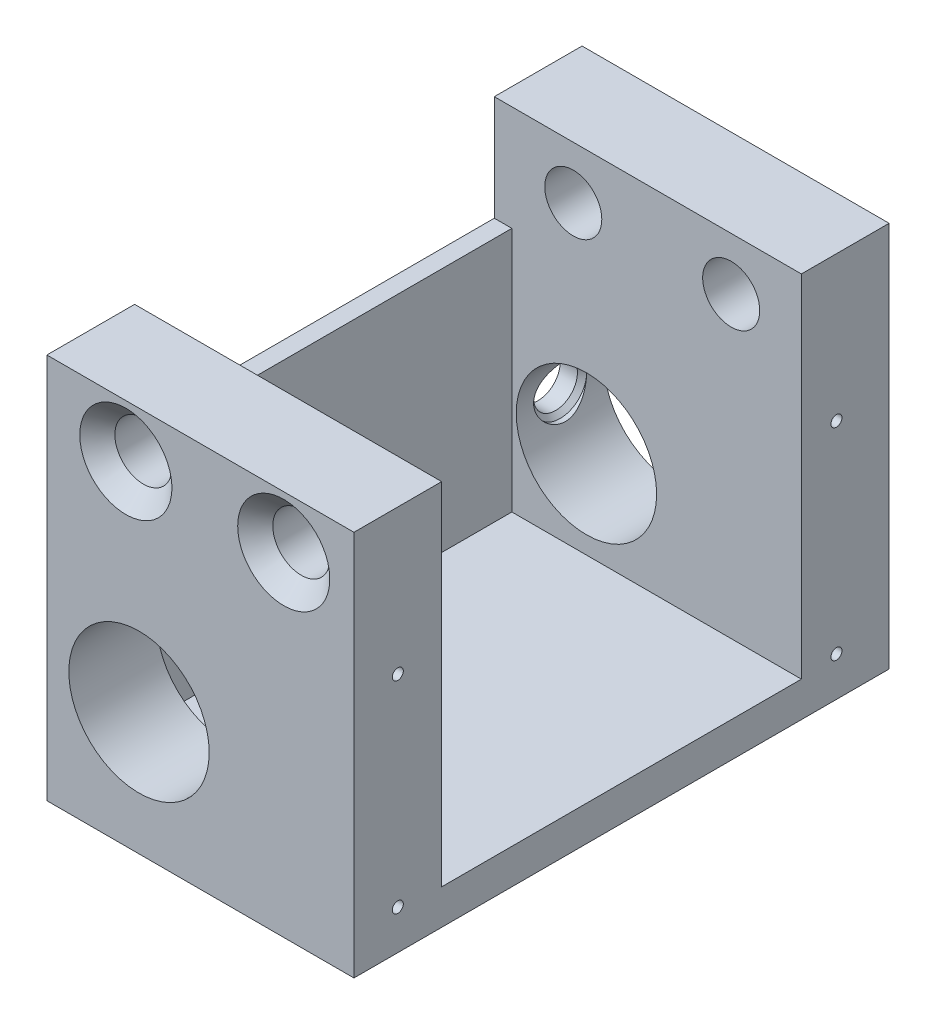
ISO-10303-21;
HEADER;
FILE_DESCRIPTION(('STEP AP214'),'2;1');
FILE_NAME('part.step','',(''),(''),'','','');
FILE_SCHEMA(('AUTOMOTIVE_DESIGN { 1 0 10303 214 1 1 1 1 }'));
ENDSEC;
DATA;
#1=APPLICATION_CONTEXT('core data for automotive mechanical design processes');
#2=APPLICATION_PROTOCOL_DEFINITION('international standard','automotive_design',2000,#1);
#3=PRODUCT_CONTEXT('',#1,'mechanical');
#4=PRODUCT('Part','Part','',(#3));
#5=PRODUCT_RELATED_PRODUCT_CATEGORY('part','',(#4));
#6=PRODUCT_DEFINITION_FORMATION('','',#4);
#7=PRODUCT_DEFINITION_CONTEXT('part definition',#1,'design');
#8=PRODUCT_DEFINITION('design','',#6,#7);
#9=PRODUCT_DEFINITION_SHAPE('','',#8);
#10=(LENGTH_UNIT() NAMED_UNIT(*) SI_UNIT(.MILLI.,.METRE.));
#11=(NAMED_UNIT(*) PLANE_ANGLE_UNIT() SI_UNIT($,.RADIAN.));
#12=(NAMED_UNIT(*) SI_UNIT($,.STERADIAN.) SOLID_ANGLE_UNIT());
#13=UNCERTAINTY_MEASURE_WITH_UNIT(LENGTH_MEASURE(1.E-05),#10,'distance_accuracy_value','');
#14=(GEOMETRIC_REPRESENTATION_CONTEXT(3) GLOBAL_UNCERTAINTY_ASSIGNED_CONTEXT((#13)) GLOBAL_UNIT_ASSIGNED_CONTEXT((#10,
#11,#12)) REPRESENTATION_CONTEXT('',''));
#15=CARTESIAN_POINT('',(0.,0.,0.));
#16=DIRECTION('',(0.,0.,1.));
#17=DIRECTION('',(1.,0.,0.));
#18=AXIS2_PLACEMENT_3D('',#15,#16,#17);
#19=CARTESIAN_POINT('',(0.,0.,30.5));
#20=DIRECTION('',(1.,0.,0.));
#21=DIRECTION('',(0.,0.,-1.));
#22=AXIS2_PLACEMENT_3D('',#19,#20,#21);
#23=PLANE('',#22);
#24=DIRECTION('',(0.,0.,-1.));
#25=VECTOR('',#24,1.);
#26=CARTESIAN_POINT('',(0.,32.,30.5));
#27=LINE('',#26,#25);
#28=CARTESIAN_POINT('',(0.,32.,20.5));
#29=VERTEX_POINT('',#28);
#30=CARTESIAN_POINT('',(0.,32.,-20.5));
#31=VERTEX_POINT('',#30);
#32=EDGE_CURVE('E204',#29,#31,#27,.T.);
#33=ORIENTED_EDGE('',*,*,#32,.T.);
#34=DIRECTION('',(0.,1.,0.));
#35=VECTOR('',#34,1.);
#36=CARTESIAN_POINT('',(0.,0.,-20.5));
#37=LINE('',#36,#35);
#38=CARTESIAN_POINT('',(0.,44.,-20.5));
#39=VERTEX_POINT('',#38);
#40=EDGE_CURVE('E207',#31,#39,#37,.T.);
#41=ORIENTED_EDGE('',*,*,#40,.T.);
#42=DIRECTION('',(0.,0.,-1.));
#43=VECTOR('',#42,1.);
#44=CARTESIAN_POINT('',(0.,44.,30.5));
#45=LINE('',#44,#43);
#46=CARTESIAN_POINT('',(0.,44.,-30.5));
#47=VERTEX_POINT('',#46);
#48=EDGE_CURVE('E94',#39,#47,#45,.T.);
#49=ORIENTED_EDGE('',*,*,#48,.T.);
#50=DIRECTION('',(0.,-1.,0.));
#51=VECTOR('',#50,1.);
#52=CARTESIAN_POINT('',(0.,0.,-30.5));
#53=LINE('',#52,#51);
#54=CARTESIAN_POINT('',(0.,0.,-30.5));
#55=VERTEX_POINT('',#54);
#56=EDGE_CURVE('E228',#47,#55,#53,.T.);
#57=ORIENTED_EDGE('',*,*,#56,.T.);
#58=DIRECTION('',(0.,0.,-1.));
#59=VECTOR('',#58,1.);
#60=CARTESIAN_POINT('',(0.,0.,30.5));
#61=LINE('',#60,#59);
#62=CARTESIAN_POINT('',(0.,0.,30.5));
#63=VERTEX_POINT('',#62);
#64=EDGE_CURVE('E167',#63,#55,#61,.T.);
#65=ORIENTED_EDGE('',*,*,#64,.F.);
#66=DIRECTION('',(0.,-1.,0.));
#67=VECTOR('',#66,1.);
#68=CARTESIAN_POINT('',(0.,0.,30.5));
#69=LINE('',#68,#67);
#70=CARTESIAN_POINT('',(0.,44.,30.5));
#71=VERTEX_POINT('',#70);
#72=EDGE_CURVE('E235',#71,#63,#69,.T.);
#73=ORIENTED_EDGE('',*,*,#72,.F.);
#74=CARTESIAN_POINT('',(0.,44.,20.5));
#75=VERTEX_POINT('',#74);
#76=EDGE_CURVE('E249',#71,#75,#45,.T.);
#77=ORIENTED_EDGE('',*,*,#76,.T.);
#78=DIRECTION('',(0.,-1.,0.));
#79=VECTOR('',#78,1.);
#80=CARTESIAN_POINT('',(0.,0.,20.5));
#81=LINE('',#80,#79);
#82=EDGE_CURVE('E200',#75,#29,#81,.T.);
#83=ORIENTED_EDGE('',*,*,#82,.T.);
#84=EDGE_LOOP('',(#33,#41,#49,#57,#65,#73,#77,#83));
#85=FACE_BOUND('',#84,.T.);
#86=CARTESIAN_POINT('',(0.,14.,-25.5));
#87=DIRECTION('',(-1.,0.,0.));
#88=DIRECTION('',(0.,0.,1.));
#89=AXIS2_PLACEMENT_3D('',#86,#87,#88);
#90=CIRCLE('',#89,2.49999999999999);
#91=CARTESIAN_POINT('',(0.,14.,-23.));
#92=VERTEX_POINT('',#91);
#93=EDGE_CURVE('E164',#92,#92,#90,.T.);
#94=ORIENTED_EDGE('',*,*,#93,.F.);
#95=EDGE_LOOP('',(#94));
#96=FACE_BOUND('',#95,.T.);
#97=ADVANCED_FACE('F45',(#85,#96),#23,.F.);
#98=CARTESIAN_POINT('',(2.,4.,20.5));
#99=DIRECTION('',(0.,0.,1.));
#100=DIRECTION('',(1.,0.,0.));
#101=AXIS2_PLACEMENT_3D('',#98,#99,#100);
#102=PLANE('',#101);
#103=CARTESIAN_POINT('',(10.5,14.,20.5));
#104=DIRECTION('',(0.,0.,1.));
#105=DIRECTION('',(1.,0.,0.));
#106=AXIS2_PLACEMENT_3D('',#103,#104,#105);
#107=CIRCLE('',#106,8.);
#108=CARTESIAN_POINT('',(18.5,14.,20.5));
#109=VERTEX_POINT('',#108);
#110=EDGE_CURVE('E175',#109,#109,#107,.T.);
#111=ORIENTED_EDGE('',*,*,#110,.T.);
#112=EDGE_LOOP('',(#111));
#113=FACE_BOUND('',#112,.T.);
#114=DIRECTION('',(0.,-1.,0.));
#115=VECTOR('',#114,1.);
#116=CARTESIAN_POINT('',(35.,4.,20.5));
#117=LINE('',#116,#115);
#118=CARTESIAN_POINT('',(35.,44.,20.5));
#119=VERTEX_POINT('',#118);
#120=CARTESIAN_POINT('',(35.,4.,20.5));
#121=VERTEX_POINT('',#120);
#122=EDGE_CURVE('E221',#119,#121,#117,.T.);
#123=ORIENTED_EDGE('',*,*,#122,.T.);
#124=DIRECTION('',(1.,0.,0.));
#125=VECTOR('',#124,1.);
#126=CARTESIAN_POINT('',(2.,4.,20.5));
#127=LINE('',#126,#125);
#128=CARTESIAN_POINT('',(2.,4.,20.5));
#129=VERTEX_POINT('',#128);
#130=EDGE_CURVE('E229',#129,#121,#127,.T.);
#131=ORIENTED_EDGE('',*,*,#130,.F.);
#132=DIRECTION('',(0.,-1.,0.));
#133=VECTOR('',#132,1.);
#134=CARTESIAN_POINT('',(2.,4.,20.5));
#135=LINE('',#134,#133);
#136=CARTESIAN_POINT('',(2.,32.,20.5));
#137=VERTEX_POINT('',#136);
#138=EDGE_CURVE('E213',#137,#129,#135,.T.);
#139=ORIENTED_EDGE('',*,*,#138,.F.);
#140=DIRECTION('',(1.,0.,0.));
#141=VECTOR('',#140,1.);
#142=CARTESIAN_POINT('',(-31.,32.,20.5));
#143=LINE('',#142,#141);
#144=EDGE_CURVE('E197',#29,#137,#143,.T.);
#145=ORIENTED_EDGE('',*,*,#144,.F.);
#146=ORIENTED_EDGE('',*,*,#82,.F.);
#147=DIRECTION('',(1.,0.,0.));
#148=VECTOR('',#147,1.);
#149=CARTESIAN_POINT('',(2.,44.,20.5));
#150=LINE('',#149,#148);
#151=EDGE_CURVE('E231',#75,#119,#150,.T.);
#152=ORIENTED_EDGE('',*,*,#151,.T.);
#153=EDGE_LOOP('',(#123,#131,#139,#145,#146,#152));
#154=FACE_BOUND('',#153,.T.);
#155=CARTESIAN_POINT('',(27.,38.,20.5));
#156=DIRECTION('',(0.,0.,-1.));
#157=DIRECTION('',(-1.,0.,0.));
#158=AXIS2_PLACEMENT_3D('',#155,#156,#157);
#159=CIRCLE('',#158,3.25);
#160=CARTESIAN_POINT('',(23.75,38.,20.5));
#161=VERTEX_POINT('',#160);
#162=EDGE_CURVE('E459',#161,#161,#159,.T.);
#163=ORIENTED_EDGE('',*,*,#162,.F.);
#164=EDGE_LOOP('',(#163));
#165=FACE_BOUND('',#164,.T.);
#166=CARTESIAN_POINT('',(9.,38.,20.5));
#167=DIRECTION('',(0.,0.,-1.));
#168=DIRECTION('',(-1.,0.,0.));
#169=AXIS2_PLACEMENT_3D('',#166,#167,#168);
#170=CIRCLE('',#169,3.25);
#171=CARTESIAN_POINT('',(5.75,38.,20.5));
#172=VERTEX_POINT('',#171);
#173=EDGE_CURVE('E450',#172,#172,#170,.T.);
#174=ORIENTED_EDGE('',*,*,#173,.F.);
#175=EDGE_LOOP('',(#174));
#176=FACE_BOUND('',#175,.T.);
#177=ADVANCED_FACE('F277',(#113,#154,#165,#176),#102,.F.);
#178=CARTESIAN_POINT('',(2.,4.,-20.5));
#179=DIRECTION('',(0.,0.,-1.));
#180=DIRECTION('',(-1.,0.,0.));
#181=AXIS2_PLACEMENT_3D('',#178,#179,#180);
#182=PLANE('',#181);
#183=CARTESIAN_POINT('',(27.,38.,-20.5));
#184=DIRECTION('',(0.,0.,1.));
#185=DIRECTION('',(1.,0.,0.));
#186=AXIS2_PLACEMENT_3D('',#183,#184,#185);
#187=CIRCLE('',#186,3.25);
#188=CARTESIAN_POINT('',(30.25,38.,-20.5));
#189=VERTEX_POINT('',#188);
#190=EDGE_CURVE('E332',#189,#189,#187,.T.);
#191=ORIENTED_EDGE('',*,*,#190,.F.);
#192=EDGE_LOOP('',(#191));
#193=FACE_BOUND('',#192,.T.);
#194=CARTESIAN_POINT('',(10.5,14.,-20.5));
#195=DIRECTION('',(0.,0.,-1.));
#196=DIRECTION('',(-1.,0.,0.));
#197=AXIS2_PLACEMENT_3D('',#194,#195,#196);
#198=CIRCLE('',#197,8.);
#199=CARTESIAN_POINT('',(2.5,14.,-20.5));
#200=VERTEX_POINT('',#199);
#201=EDGE_CURVE('E177',#200,#200,#198,.T.);
#202=ORIENTED_EDGE('',*,*,#201,.T.);
#203=EDGE_LOOP('',(#202));
#204=FACE_BOUND('',#203,.T.);
#205=DIRECTION('',(0.,1.,0.));
#206=VECTOR('',#205,1.);
#207=CARTESIAN_POINT('',(35.,4.,-20.5));
#208=LINE('',#207,#206);
#209=CARTESIAN_POINT('',(35.,4.,-20.5));
#210=VERTEX_POINT('',#209);
#211=CARTESIAN_POINT('',(35.,44.,-20.5));
#212=VERTEX_POINT('',#211);
#213=EDGE_CURVE('E209',#210,#212,#208,.T.);
#214=ORIENTED_EDGE('',*,*,#213,.T.);
#215=DIRECTION('',(1.,0.,0.));
#216=VECTOR('',#215,1.);
#217=CARTESIAN_POINT('',(2.,44.,-20.5));
#218=LINE('',#217,#216);
#219=EDGE_CURVE('E219',#39,#212,#218,.T.);
#220=ORIENTED_EDGE('',*,*,#219,.F.);
#221=ORIENTED_EDGE('',*,*,#40,.F.);
#222=DIRECTION('',(1.,0.,0.));
#223=VECTOR('',#222,1.);
#224=CARTESIAN_POINT('',(-31.,32.,-20.5));
#225=LINE('',#224,#223);
#226=CARTESIAN_POINT('',(2.,32.,-20.5));
#227=VERTEX_POINT('',#226);
#228=EDGE_CURVE('E198',#31,#227,#225,.T.);
#229=ORIENTED_EDGE('',*,*,#228,.T.);
#230=DIRECTION('',(0.,1.,0.));
#231=VECTOR('',#230,1.);
#232=CARTESIAN_POINT('',(2.,4.,-20.5));
#233=LINE('',#232,#231);
#234=CARTESIAN_POINT('',(2.,4.,-20.5));
#235=VERTEX_POINT('',#234);
#236=EDGE_CURVE('E210',#235,#227,#233,.T.);
#237=ORIENTED_EDGE('',*,*,#236,.F.);
#238=DIRECTION('',(1.,0.,0.));
#239=VECTOR('',#238,1.);
#240=CARTESIAN_POINT('',(2.,4.,-20.5));
#241=LINE('',#240,#239);
#242=EDGE_CURVE('E226',#235,#210,#241,.T.);
#243=ORIENTED_EDGE('',*,*,#242,.T.);
#244=EDGE_LOOP('',(#214,#220,#221,#229,#237,#243));
#245=FACE_BOUND('',#244,.T.);
#246=CARTESIAN_POINT('',(9.,38.,-20.5));
#247=DIRECTION('',(0.,0.,1.));
#248=DIRECTION('',(1.,0.,0.));
#249=AXIS2_PLACEMENT_3D('',#246,#247,#248);
#250=CIRCLE('',#249,3.25);
#251=CARTESIAN_POINT('',(12.25,38.,-20.5));
#252=VERTEX_POINT('',#251);
#253=EDGE_CURVE('E468',#252,#252,#250,.T.);
#254=ORIENTED_EDGE('',*,*,#253,.F.);
#255=EDGE_LOOP('',(#254));
#256=FACE_BOUND('',#255,.T.);
#257=ADVANCED_FACE('F286',(#193,#204,#245,#256),#182,.F.);
#258=CARTESIAN_POINT('',(0.,44.,30.5));
#259=DIRECTION('',(0.,-1.,0.));
#260=DIRECTION('',(0.,0.,-1.));
#261=AXIS2_PLACEMENT_3D('',#258,#259,#260);
#262=PLANE('',#261);
#263=ORIENTED_EDGE('',*,*,#48,.F.);
#264=ORIENTED_EDGE('',*,*,#219,.T.);
#265=DIRECTION('',(0.,0.,-1.));
#266=VECTOR('',#265,1.);
#267=CARTESIAN_POINT('',(35.,44.,30.5));
#268=LINE('',#267,#266);
#269=CARTESIAN_POINT('',(35.,44.,-30.5));
#270=VERTEX_POINT('',#269);
#271=EDGE_CURVE('E251',#212,#270,#268,.T.);
#272=ORIENTED_EDGE('',*,*,#271,.T.);
#273=DIRECTION('',(-1.,0.,0.));
#274=VECTOR('',#273,1.);
#275=CARTESIAN_POINT('',(0.,44.,-30.5));
#276=LINE('',#275,#274);
#277=EDGE_CURVE('E237',#270,#47,#276,.T.);
#278=ORIENTED_EDGE('',*,*,#277,.T.);
#279=EDGE_LOOP('',(#263,#264,#272,#278));
#280=FACE_BOUND('',#279,.T.);
#281=ADVANCED_FACE('F257',(#280),#262,.F.);
#282=CARTESIAN_POINT('',(0.,0.,30.5));
#283=DIRECTION('',(0.,1.,0.));
#284=DIRECTION('',(0.,0.,1.));
#285=AXIS2_PLACEMENT_3D('',#282,#283,#284);
#286=PLANE('',#285);
#287=DIRECTION('',(1.,0.,0.));
#288=VECTOR('',#287,1.);
#289=CARTESIAN_POINT('',(0.,0.,-30.5));
#290=LINE('',#289,#288);
#291=CARTESIAN_POINT('',(35.,0.,-30.5));
#292=VERTEX_POINT('',#291);
#293=EDGE_CURVE('E243',#55,#292,#290,.T.);
#294=ORIENTED_EDGE('',*,*,#293,.T.);
#295=DIRECTION('',(0.,0.,-1.));
#296=VECTOR('',#295,1.);
#297=CARTESIAN_POINT('',(35.,0.,30.5));
#298=LINE('',#297,#296);
#299=CARTESIAN_POINT('',(35.,0.,30.5));
#300=VERTEX_POINT('',#299);
#301=EDGE_CURVE('E168',#300,#292,#298,.T.);
#302=ORIENTED_EDGE('',*,*,#301,.F.);
#303=DIRECTION('',(1.,0.,0.));
#304=VECTOR('',#303,1.);
#305=CARTESIAN_POINT('',(0.,0.,30.5));
#306=LINE('',#305,#304);
#307=EDGE_CURVE('E102',#63,#300,#306,.T.);
#308=ORIENTED_EDGE('',*,*,#307,.F.);
#309=ORIENTED_EDGE('',*,*,#64,.T.);
#310=EDGE_LOOP('',(#294,#302,#308,#309));
#311=FACE_BOUND('',#310,.T.);
#312=ADVANCED_FACE('F270',(#311),#286,.F.);
#313=CARTESIAN_POINT('',(35.,0.,30.5));
#314=DIRECTION('',(-1.,0.,0.));
#315=DIRECTION('',(0.,0.,1.));
#316=AXIS2_PLACEMENT_3D('',#313,#314,#315);
#317=PLANE('',#316);
#318=CARTESIAN_POINT('',(35.,4.49999999999999,25.5));
#319=DIRECTION('',(1.,0.,0.));
#320=DIRECTION('',(0.,0.,-1.));
#321=AXIS2_PLACEMENT_3D('',#318,#319,#320);
#322=CIRCLE('',#321,0.62499999999999);
#323=CARTESIAN_POINT('',(35.,4.49999999999999,24.875));
#324=VERTEX_POINT('',#323);
#325=EDGE_CURVE('E421',#324,#324,#322,.T.);
#326=ORIENTED_EDGE('',*,*,#325,.F.);
#327=EDGE_LOOP('',(#326));
#328=FACE_BOUND('',#327,.T.);
#329=CARTESIAN_POINT('',(35.,27.5,-24.5));
#330=DIRECTION('',(1.,0.,0.));
#331=DIRECTION('',(0.,0.,-1.));
#332=AXIS2_PLACEMENT_3D('',#329,#330,#331);
#333=CIRCLE('',#332,0.62499999999999);
#334=CARTESIAN_POINT('',(35.,27.5,-25.125));
#335=VERTEX_POINT('',#334);
#336=EDGE_CURVE('E429',#335,#335,#333,.T.);
#337=ORIENTED_EDGE('',*,*,#336,.F.);
#338=EDGE_LOOP('',(#337));
#339=FACE_BOUND('',#338,.T.);
#340=CARTESIAN_POINT('',(35.,4.5,-24.5));
#341=DIRECTION('',(1.,0.,0.));
#342=DIRECTION('',(0.,0.,-1.));
#343=AXIS2_PLACEMENT_3D('',#340,#341,#342);
#344=CIRCLE('',#343,0.62499999999999);
#345=CARTESIAN_POINT('',(35.,4.5,-25.125));
#346=VERTEX_POINT('',#345);
#347=EDGE_CURVE('E435',#346,#346,#344,.T.);
#348=ORIENTED_EDGE('',*,*,#347,.F.);
#349=EDGE_LOOP('',(#348));
#350=FACE_BOUND('',#349,.T.);
#351=CARTESIAN_POINT('',(35.,27.5,25.5));
#352=DIRECTION('',(1.,0.,0.));
#353=DIRECTION('',(0.,0.,-1.));
#354=AXIS2_PLACEMENT_3D('',#351,#352,#353);
#355=CIRCLE('',#354,0.62499999999999);
#356=CARTESIAN_POINT('',(35.,27.5,24.875));
#357=VERTEX_POINT('',#356);
#358=EDGE_CURVE('E441',#357,#357,#355,.T.);
#359=ORIENTED_EDGE('',*,*,#358,.F.);
#360=EDGE_LOOP('',(#359));
#361=FACE_BOUND('',#360,.T.);
#362=ORIENTED_EDGE('',*,*,#271,.F.);
#363=ORIENTED_EDGE('',*,*,#213,.F.);
#364=DIRECTION('',(0.,0.,-1.));
#365=VECTOR('',#364,1.);
#366=CARTESIAN_POINT('',(35.,4.,20.5));
#367=LINE('',#366,#365);
#368=EDGE_CURVE('E214',#121,#210,#367,.T.);
#369=ORIENTED_EDGE('',*,*,#368,.F.);
#370=ORIENTED_EDGE('',*,*,#122,.F.);
#371=CARTESIAN_POINT('',(35.,44.,30.5));
#372=VERTEX_POINT('',#371);
#373=EDGE_CURVE('E172',#372,#119,#268,.T.);
#374=ORIENTED_EDGE('',*,*,#373,.F.);
#375=DIRECTION('',(0.,1.,0.));
#376=VECTOR('',#375,1.);
#377=CARTESIAN_POINT('',(35.,0.,30.5));
#378=LINE('',#377,#376);
#379=EDGE_CURVE('E239',#300,#372,#378,.T.);
#380=ORIENTED_EDGE('',*,*,#379,.F.);
#381=ORIENTED_EDGE('',*,*,#301,.T.);
#382=DIRECTION('',(0.,1.,0.));
#383=VECTOR('',#382,1.);
#384=CARTESIAN_POINT('',(35.,0.,-30.5));
#385=LINE('',#384,#383);
#386=EDGE_CURVE('E245',#292,#270,#385,.T.);
#387=ORIENTED_EDGE('',*,*,#386,.T.);
#388=EDGE_LOOP('',(#362,#363,#369,#370,#374,#380,#381,#387));
#389=FACE_BOUND('',#388,.T.);
#390=ADVANCED_FACE('F263',(#328,#339,#350,#361,#389),#317,.F.);
#391=ORIENTED_EDGE('',*,*,#151,.F.);
#392=ORIENTED_EDGE('',*,*,#76,.F.);
#393=DIRECTION('',(-1.,0.,0.));
#394=VECTOR('',#393,1.);
#395=CARTESIAN_POINT('',(0.,44.,30.5));
#396=LINE('',#395,#394);
#397=EDGE_CURVE('E72',#372,#71,#396,.T.);
#398=ORIENTED_EDGE('',*,*,#397,.F.);
#399=ORIENTED_EDGE('',*,*,#373,.T.);
#400=EDGE_LOOP('',(#391,#392,#398,#399));
#401=FACE_BOUND('',#400,.T.);
#402=ADVANCED_FACE('F273',(#401),#262,.F.);
#403=CARTESIAN_POINT('',(0.,0.,30.5));
#404=DIRECTION('',(0.,0.,-1.));
#405=DIRECTION('',(-1.,0.,0.));
#406=AXIS2_PLACEMENT_3D('',#403,#404,#405);
#407=PLANE('',#406);
#408=CARTESIAN_POINT('',(9.,38.,30.5));
#409=DIRECTION('',(0.,0.,-1.));
#410=DIRECTION('',(-1.,0.,0.));
#411=AXIS2_PLACEMENT_3D('',#408,#409,#410);
#412=CIRCLE('',#411,5.25);
#413=CARTESIAN_POINT('',(3.75,38.,30.5));
#414=VERTEX_POINT('',#413);
#415=EDGE_CURVE('E447',#414,#414,#412,.T.);
#416=ORIENTED_EDGE('',*,*,#415,.T.);
#417=EDGE_LOOP('',(#416));
#418=FACE_BOUND('',#417,.T.);
#419=CARTESIAN_POINT('',(27.,38.,30.5));
#420=DIRECTION('',(0.,0.,-1.));
#421=DIRECTION('',(-1.,0.,0.));
#422=AXIS2_PLACEMENT_3D('',#419,#420,#421);
#423=CIRCLE('',#422,5.25);
#424=CARTESIAN_POINT('',(21.75,38.,30.5));
#425=VERTEX_POINT('',#424);
#426=EDGE_CURVE('E456',#425,#425,#423,.T.);
#427=ORIENTED_EDGE('',*,*,#426,.T.);
#428=EDGE_LOOP('',(#427));
#429=FACE_BOUND('',#428,.T.);
#430=CARTESIAN_POINT('',(10.5,14.,30.5));
#431=DIRECTION('',(0.,0.,1.));
#432=DIRECTION('',(1.,0.,0.));
#433=AXIS2_PLACEMENT_3D('',#430,#431,#432);
#434=CIRCLE('',#433,8.);
#435=CARTESIAN_POINT('',(18.5,14.,30.5));
#436=VERTEX_POINT('',#435);
#437=EDGE_CURVE('E185',#436,#436,#434,.T.);
#438=ORIENTED_EDGE('',*,*,#437,.F.);
#439=EDGE_LOOP('',(#438));
#440=FACE_BOUND('',#439,.T.);
#441=ORIENTED_EDGE('',*,*,#72,.T.);
#442=ORIENTED_EDGE('',*,*,#307,.T.);
#443=ORIENTED_EDGE('',*,*,#379,.T.);
#444=ORIENTED_EDGE('',*,*,#397,.T.);
#445=EDGE_LOOP('',(#441,#442,#443,#444));
#446=FACE_BOUND('',#445,.T.);
#447=ADVANCED_FACE('F269',(#418,#429,#440,#446),#407,.F.);
#448=CARTESIAN_POINT('',(0.,0.,-30.5));
#449=DIRECTION('',(0.,0.,-1.));
#450=DIRECTION('',(-1.,0.,0.));
#451=AXIS2_PLACEMENT_3D('',#448,#449,#450);
#452=PLANE('',#451);
#453=CARTESIAN_POINT('',(9.,38.,-30.5));
#454=DIRECTION('',(0.,0.,1.));
#455=DIRECTION('',(1.,0.,0.));
#456=AXIS2_PLACEMENT_3D('',#453,#454,#455);
#457=CIRCLE('',#456,5.25);
#458=CARTESIAN_POINT('',(14.25,38.,-30.5));
#459=VERTEX_POINT('',#458);
#460=EDGE_CURVE('E465',#459,#459,#457,.T.);
#461=ORIENTED_EDGE('',*,*,#460,.T.);
#462=EDGE_LOOP('',(#461));
#463=FACE_BOUND('',#462,.T.);
#464=CARTESIAN_POINT('',(27.,38.,-30.5));
#465=DIRECTION('',(0.,0.,1.));
#466=DIRECTION('',(1.,0.,0.));
#467=AXIS2_PLACEMENT_3D('',#464,#465,#466);
#468=CIRCLE('',#467,5.25);
#469=CARTESIAN_POINT('',(32.25,38.,-30.5));
#470=VERTEX_POINT('',#469);
#471=EDGE_CURVE('E474',#470,#470,#468,.T.);
#472=ORIENTED_EDGE('',*,*,#471,.T.);
#473=EDGE_LOOP('',(#472));
#474=FACE_BOUND('',#473,.T.);
#475=CARTESIAN_POINT('',(10.5,14.,-30.5));
#476=DIRECTION('',(0.,0.,1.));
#477=DIRECTION('',(1.,0.,0.));
#478=AXIS2_PLACEMENT_3D('',#475,#476,#477);
#479=CIRCLE('',#478,8.);
#480=CARTESIAN_POINT('',(18.5,14.,-30.5));
#481=VERTEX_POINT('',#480);
#482=EDGE_CURVE('E178',#481,#481,#479,.T.);
#483=ORIENTED_EDGE('',*,*,#482,.T.);
#484=EDGE_LOOP('',(#483));
#485=FACE_BOUND('',#484,.T.);
#486=ORIENTED_EDGE('',*,*,#56,.F.);
#487=ORIENTED_EDGE('',*,*,#277,.F.);
#488=ORIENTED_EDGE('',*,*,#386,.F.);
#489=ORIENTED_EDGE('',*,*,#293,.F.);
#490=EDGE_LOOP('',(#486,#487,#488,#489));
#491=FACE_BOUND('',#490,.T.);
#492=ADVANCED_FACE('F266',(#463,#474,#485,#491),#452,.T.);
#493=CARTESIAN_POINT('',(2.,4.,20.5));
#494=DIRECTION('',(0.,-1.,0.));
#495=DIRECTION('',(0.,0.,-1.));
#496=AXIS2_PLACEMENT_3D('',#493,#494,#495);
#497=PLANE('',#496);
#498=ORIENTED_EDGE('',*,*,#368,.T.);
#499=ORIENTED_EDGE('',*,*,#242,.F.);
#500=DIRECTION('',(0.,0.,-1.));
#501=VECTOR('',#500,1.);
#502=CARTESIAN_POINT('',(2.,4.,20.5));
#503=LINE('',#502,#501);
#504=EDGE_CURVE('E216',#129,#235,#503,.T.);
#505=ORIENTED_EDGE('',*,*,#504,.F.);
#506=ORIENTED_EDGE('',*,*,#130,.T.);
#507=EDGE_LOOP('',(#498,#499,#505,#506));
#508=FACE_BOUND('',#507,.T.);
#509=ADVANCED_FACE('F289',(#508),#497,.F.);
#510=CARTESIAN_POINT('',(2.,0.,0.));
#511=DIRECTION('',(-1.,0.,0.));
#512=DIRECTION('',(0.,0.,1.));
#513=AXIS2_PLACEMENT_3D('',#510,#511,#512);
#514=PLANE('',#513);
#515=ORIENTED_EDGE('',*,*,#236,.T.);
#516=DIRECTION('',(0.,0.,-1.));
#517=VECTOR('',#516,1.);
#518=CARTESIAN_POINT('',(2.,32.,-20.5));
#519=LINE('',#518,#517);
#520=EDGE_CURVE('E182',#137,#227,#519,.T.);
#521=ORIENTED_EDGE('',*,*,#520,.F.);
#522=ORIENTED_EDGE('',*,*,#138,.T.);
#523=ORIENTED_EDGE('',*,*,#504,.T.);
#524=EDGE_LOOP('',(#515,#521,#522,#523));
#525=FACE_BOUND('',#524,.T.);
#526=ADVANCED_FACE('F293',(#525),#514,.F.);
#527=CARTESIAN_POINT('',(-31.,32.,-20.5));
#528=DIRECTION('',(0.,-1.,0.));
#529=DIRECTION('',(0.,0.,-1.));
#530=AXIS2_PLACEMENT_3D('',#527,#528,#529);
#531=PLANE('',#530);
#532=ORIENTED_EDGE('',*,*,#144,.T.);
#533=ORIENTED_EDGE('',*,*,#520,.T.);
#534=ORIENTED_EDGE('',*,*,#228,.F.);
#535=ORIENTED_EDGE('',*,*,#32,.F.);
#536=EDGE_LOOP('',(#532,#533,#534,#535));
#537=FACE_BOUND('',#536,.T.);
#538=ADVANCED_FACE('F282',(#537),#531,.F.);
#539=CARTESIAN_POINT('',(10.5,14.,-30.5));
#540=DIRECTION('',(0.,0.,1.));
#541=DIRECTION('',(1.,0.,0.));
#542=AXIS2_PLACEMENT_3D('',#539,#540,#541);
#543=CYLINDRICAL_SURFACE('',#542,8.);
#544=CARTESIAN_POINT('',(18.5,14.,30.5));
#545=CARTESIAN_POINT('',(18.5,14.,30.3958333333333));
#546=CARTESIAN_POINT('',(18.5,14.,30.2916666666667));
#547=CARTESIAN_POINT('',(18.5,14.,30.0833333333333));
#548=CARTESIAN_POINT('',(18.5,14.,29.9791666666667));
#549=CARTESIAN_POINT('',(18.5,14.,29.7708333333333));
#550=CARTESIAN_POINT('',(18.5,14.,29.6666666666667));
#551=CARTESIAN_POINT('',(18.5,14.,29.4583333333333));
#552=CARTESIAN_POINT('',(18.5,14.,29.3541666666667));
#553=CARTESIAN_POINT('',(18.5,14.,29.1458333333333));
#554=CARTESIAN_POINT('',(18.5,14.,29.0416666666667));
#555=CARTESIAN_POINT('',(18.5,14.,28.8333333333333));
#556=CARTESIAN_POINT('',(18.5,14.,28.7291666666667));
#557=CARTESIAN_POINT('',(18.5,14.,28.5208333333333));
#558=CARTESIAN_POINT('',(18.5,14.,28.4166666666667));
#559=CARTESIAN_POINT('',(18.5,14.,28.2083333333333));
#560=CARTESIAN_POINT('',(18.5,14.,28.1041666666667));
#561=CARTESIAN_POINT('',(18.5,14.,27.8958333333333));
#562=CARTESIAN_POINT('',(18.5,14.,27.7916666666667));
#563=CARTESIAN_POINT('',(18.5,14.,27.5833333333333));
#564=CARTESIAN_POINT('',(18.5,14.,27.4791666666667));
#565=CARTESIAN_POINT('',(18.5,14.,27.2708333333333));
#566=CARTESIAN_POINT('',(18.5,14.,27.1666666666667));
#567=CARTESIAN_POINT('',(18.5,14.,26.9583333333333));
#568=CARTESIAN_POINT('',(18.5,14.,26.8541666666667));
#569=CARTESIAN_POINT('',(18.5,14.,26.6458333333333));
#570=CARTESIAN_POINT('',(18.5,14.,26.5416666666667));
#571=CARTESIAN_POINT('',(18.5,14.,26.3333333333333));
#572=CARTESIAN_POINT('',(18.5,14.,26.2291666666667));
#573=CARTESIAN_POINT('',(18.5,14.,26.0208333333333));
#574=CARTESIAN_POINT('',(18.5,14.,25.9166666666667));
#575=CARTESIAN_POINT('',(18.5,14.,25.7083333333333));
#576=CARTESIAN_POINT('',(18.5,14.,25.6041666666667));
#577=CARTESIAN_POINT('',(18.5,14.,25.3958333333333));
#578=CARTESIAN_POINT('',(18.5,14.,25.2916666666667));
#579=CARTESIAN_POINT('',(18.5,14.,25.0833333333333));
#580=CARTESIAN_POINT('',(18.5,14.,24.9791666666667));
#581=CARTESIAN_POINT('',(18.5,14.,24.7708333333333));
#582=CARTESIAN_POINT('',(18.5,14.,24.6666666666667));
#583=CARTESIAN_POINT('',(18.5,14.,24.4583333333333));
#584=CARTESIAN_POINT('',(18.5,14.,24.3541666666667));
#585=CARTESIAN_POINT('',(18.5,14.,24.1458333333333));
#586=CARTESIAN_POINT('',(18.5,14.,24.0416666666667));
#587=CARTESIAN_POINT('',(18.5,14.,23.8333333333333));
#588=CARTESIAN_POINT('',(18.5,14.,23.7291666666667));
#589=CARTESIAN_POINT('',(18.5,14.,23.5208333333333));
#590=CARTESIAN_POINT('',(18.5,14.,23.4166666666667));
#591=CARTESIAN_POINT('',(18.5,14.,23.2083333333333));
#592=CARTESIAN_POINT('',(18.5,14.,23.1041666666667));
#593=CARTESIAN_POINT('',(18.5,14.,22.8958333333333));
#594=CARTESIAN_POINT('',(18.5,14.,22.7916666666667));
#595=CARTESIAN_POINT('',(18.5,14.,22.5833333333333));
#596=CARTESIAN_POINT('',(18.5,14.,22.4791666666667));
#597=CARTESIAN_POINT('',(18.5,14.,22.2708333333333));
#598=CARTESIAN_POINT('',(18.5,14.,22.1666666666667));
#599=CARTESIAN_POINT('',(18.5,14.,21.9583333333333));
#600=CARTESIAN_POINT('',(18.5,14.,21.8541666666667));
#601=CARTESIAN_POINT('',(18.5,14.,21.6458333333333));
#602=CARTESIAN_POINT('',(18.5,14.,21.5416666666667));
#603=CARTESIAN_POINT('',(18.5,14.,21.3333333333333));
#604=CARTESIAN_POINT('',(18.5,14.,21.2291666666667));
#605=CARTESIAN_POINT('',(18.5,14.,21.0208333333333));
#606=CARTESIAN_POINT('',(18.5,14.,20.9166666666667));
#607=CARTESIAN_POINT('',(18.5,14.,20.7083333333333));
#608=CARTESIAN_POINT('',(18.5,14.,20.6041666666667));
#609=CARTESIAN_POINT('',(18.5,14.,20.5));
#610=B_SPLINE_CURVE_WITH_KNOTS('',3,(#544,#545,#546,#547,#548,#549,#550,#551,#552,#553,#554,
#555,#556,#557,#558,#559,#560,#561,#562,#563,#564,#565,#566,#567,#568,#569,#570,#571,#572,#573,
#574,#575,#576,#577,#578,#579,#580,#581,#582,#583,#584,#585,#586,#587,#588,#589,#590,#591,#592,
#593,#594,#595,#596,#597,#598,#599,#600,#601,#602,#603,#604,#605,#606,#607,#608,#609),
.UNSPECIFIED.,.F.,.F.,(4,2,2,2,2,2,2,2,2,2,2,2,2,2,2,2,2,2,2,2,2,2,2,2,2,2,2,2,2,2,2,2,4),(0.,
0.3125,0.625000000000001,0.937500000000001,1.25,1.5625,1.875,2.1875,2.5,2.8125,3.125,3.4375,
3.75,4.0625,4.375,4.6875,5.,5.3125,5.625,5.9375,6.25,6.5625,6.875,7.1875,7.49999999999999,
7.8125,8.12499999999999,8.43749999999999,8.74999999999999,9.06249999999999,9.37499999999999,
9.68749999999999,9.99999999999999),.UNSPECIFIED.);
#611=EDGE_CURVE('BSEAM300',#436,#109,#610,.T.);
#612=ORIENTED_EDGE('',*,*,#437,.T.);
#613=ORIENTED_EDGE('',*,*,#110,.F.);
#614=ORIENTED_EDGE('',*,*,#611,.T.);
#615=ORIENTED_EDGE('',*,*,#611,.F.);
#616=EDGE_LOOP('',(#612,#614,#613,#615));
#617=FACE_BOUND('',#616,.T.);
#618=ADVANCED_FACE('F300',(#617),#543,.F.);
#619=CARTESIAN_POINT('',(2.5,14.,-22.475));
#620=CARTESIAN_POINT('',(2.49999523361823,14.1637269219459,-22.4749936760594));
#621=CARTESIAN_POINT('',(2.50506973177694,14.3274109105186,-22.4883338644131));
#622=CARTESIAN_POINT('',(2.52480506745133,14.6498818176156,-22.5411218616533));
#623=CARTESIAN_POINT('',(2.53946434837809,14.8086695269221,-22.5805654313083));
#624=CARTESIAN_POINT('',(2.57679731379145,15.1166502839498,-22.6839621681222));
#625=CARTESIAN_POINT('',(2.59945537381073,15.2658613714529,-22.7478675729666));
#626=CARTESIAN_POINT('',(2.65053339237952,15.5514327476693,-22.8981288917839));
#627=CARTESIAN_POINT('',(2.67895492282536,15.6877895156743,-22.9844909322703));
#628=CARTESIAN_POINT('',(2.7399982036348,15.9496554117369,-23.1810976873051));
#629=CARTESIAN_POINT('',(2.77274019141757,16.074537774685,-23.2921395174402));
#630=CARTESIAN_POINT('',(2.83814756086372,16.3044146395849,-23.533261608301));
#631=CARTESIAN_POINT('',(2.87081291534575,16.4094029052378,-23.6633478163826));
#632=CARTESIAN_POINT('',(2.93377384354996,16.6005305228487,-23.9450289638689));
#633=CARTESIAN_POINT('',(2.96392798359785,16.6857787749413,-24.0972633267227));
#634=CARTESIAN_POINT('',(3.0165779916529,16.829182624451,-24.4152277208883));
#635=CARTESIAN_POINT('',(3.03907697582391,16.8873492494743,-24.5809522266769));
#636=CARTESIAN_POINT('',(3.07258203715784,16.9724548860452,-24.9139732881016));
#637=CARTESIAN_POINT('',(3.08402697802106,17.0005914678706,-25.0809181376272));
#638=CARTESIAN_POINT('',(3.09541087624011,17.0285824112462,-25.4175219381239));
#639=CARTESIAN_POINT('',(3.09535468813933,17.0284487054795,-25.5871797137515));
#640=CARTESIAN_POINT('',(3.08412057584735,17.0008175814991,-25.9133708684704));
#641=CARTESIAN_POINT('',(3.07362141586365,16.9749901652125,-26.0700734511936));
#642=CARTESIAN_POINT('',(3.04381375450619,16.8994684555031,-26.3767285103672));
#643=CARTESIAN_POINT('',(3.02450390371583,16.849770506086,-26.5266799489681));
#644=CARTESIAN_POINT('',(2.97884753545128,16.7270146319989,-26.818949376525));
#645=CARTESIAN_POINT('',(2.95237356215497,16.6535283216842,-26.9610666508191));
#646=CARTESIAN_POINT('',(2.89541341204731,16.4855805904108,-27.2314338742506));
#647=CARTESIAN_POINT('',(2.86492583528895,16.3911118428299,-27.3596789561958));
#648=CARTESIAN_POINT('',(2.80082942028156,16.1762714047814,-27.607892984396));
#649=CARTESIAN_POINT('',(2.76714975012271,16.054569628961,-27.7266952401973));
#650=CARTESIAN_POINT('',(2.70225491841565,15.7925862873518,-27.9425543093975));
#651=CARTESIAN_POINT('',(2.67104014893242,15.6523017752724,-28.0396076679294));
#652=CARTESIAN_POINT('',(2.61395299542548,15.3541187246324,-28.210529724036));
#653=CARTESIAN_POINT('',(2.58817381077461,15.1959748332264,-28.2840037399027));
#654=CARTESIAN_POINT('',(2.54555536108767,14.8683531613574,-28.4029154577619));
#655=CARTESIAN_POINT('',(2.52871205662321,14.6988805410789,-28.4483658292387));
#656=CARTESIAN_POINT('',(2.5065764059765,14.3632263622634,-28.5076829723898));
#657=CARTESIAN_POINT('',(2.50071026320379,14.1973599741364,-28.5231204225246));
#658=CARTESIAN_POINT('',(2.49941251841706,13.8653218133283,-28.5265548580295));
#659=CARTESIAN_POINT('',(2.50397855674308,13.6991501181999,-28.5145580487671));
#660=CARTESIAN_POINT('',(2.52265387253358,13.3780461440458,-28.4646537651931));
#661=CARTESIAN_POINT('',(2.53638200918576,13.2229286313091,-28.4277805036781));
#662=CARTESIAN_POINT('',(2.57161611142881,12.9211952216637,-28.3305372827731));
#663=CARTESIAN_POINT('',(2.59312308793016,12.7745804326137,-28.2701642693609));
#664=CARTESIAN_POINT('',(2.64258582279901,12.4891547374863,-28.1257023763823));
#665=CARTESIAN_POINT('',(2.67071342915665,12.3507026718862,-28.040965152331));
#666=CARTESIAN_POINT('',(2.73031366192857,12.0895158447203,-27.8509113593052));
#667=CARTESIAN_POINT('',(2.76178753565519,11.966786981788,-27.7455871042171));
#668=CARTESIAN_POINT('',(2.82692394535565,11.7329530440609,-27.5100390281351));
#669=CARTESIAN_POINT('',(2.86060604608863,11.6229610905016,-27.3787127194011));
#670=CARTESIAN_POINT('',(2.92457630236732,11.426349680871,-27.0988117106081));
#671=CARTESIAN_POINT('',(2.95486412513213,11.3397325153341,-26.9502353222236));
#672=CARTESIAN_POINT('',(3.00850925893133,11.1921909970443,-26.6387104148855));
#673=CARTESIAN_POINT('',(3.03183289521408,11.1313909019228,-26.4756968522914));
#674=CARTESIAN_POINT('',(3.06816836744694,11.0385115376035,-26.1406145309596));
#675=CARTESIAN_POINT('',(3.08118672867327,11.0064140922824,-25.968551576011));
#676=CARTESIAN_POINT('',(3.09456137771402,10.9734896893868,-25.6323388549624));
#677=CARTESIAN_POINT('',(3.09568782785011,10.9707604998783,-25.4684045116236));
#678=CARTESIAN_POINT('',(3.0871308637799,10.9917617092468,-25.142542887682));
#679=CARTESIAN_POINT('',(3.0774485106648,11.0154895108628,-24.9806154116445));
#680=CARTESIAN_POINT('',(3.0490107486583,11.0872408120144,-24.6685569560616));
#681=CARTESIAN_POINT('',(3.03055127999456,11.1344740371086,-24.5182149723292));
#682=CARTESIAN_POINT('',(2.98681615744118,11.2511941686578,-24.2275049847103));
#683=CARTESIAN_POINT('',(2.96153876721821,11.3206867447919,-24.0871395330881));
#684=CARTESIAN_POINT('',(2.90534803610925,11.4842287972136,-23.8122692501651));
#685=CARTESIAN_POINT('',(2.87420685298057,11.579385404848,-23.6784703084218));
#686=CARTESIAN_POINT('',(2.81057059831252,11.7898524250097,-23.4281324944933));
#687=CARTESIAN_POINT('',(2.77807509537824,11.9051692971868,-23.3115991766492));
#688=CARTESIAN_POINT('',(2.71322938856955,12.1603155049525,-23.092514584541));
#689=CARTESIAN_POINT('',(2.68098693152449,12.3011487902825,-22.9910953118378));
#690=CARTESIAN_POINT('',(2.62216979083553,12.598994581835,-22.813388459114));
#691=CARTESIAN_POINT('',(2.5955957109264,12.7560088088389,-22.7371035556662));
#692=CARTESIAN_POINT('',(2.55002705386684,13.0902072938771,-22.6092437163616));
#693=CARTESIAN_POINT('',(2.5314817644383,13.2680091863057,-22.5591072387239));
#694=CARTESIAN_POINT('',(2.50647408971147,13.6305613903776,-22.4919976311691));
#695=CARTESIAN_POINT('',(2.50000537671212,13.8153080114299,-22.4750071337148));
#696=CARTESIAN_POINT('',(2.5,14.,-22.475));
#697=B_SPLINE_CURVE_WITH_KNOTS('',3,(#619,#620,#621,#622,#623,#624,#625,#626,#627,#628,#629,
#630,#631,#632,#633,#634,#635,#636,#637,#638,#639,#640,#641,#642,#643,#644,#645,#646,#647,#648,
#649,#650,#651,#652,#653,#654,#655,#656,#657,#658,#659,#660,#661,#662,#663,#664,#665,#666,#667,
#668,#669,#670,#671,#672,#673,#674,#675,#676,#677,#678,#679,#680,#681,#682,#683,#684,#685,#686,
#687,#688,#689,#690,#691,#692,#693,#694,#695,#696),.UNSPECIFIED.,.T.,.F.,(4,2,2,2,2,2,2,2,2,2,2,
2,2,2,2,2,2,2,2,2,2,2,2,2,2,2,2,2,2,2,2,2,2,2,2,2,2,2,4),(0.,0.490499424620261,
0.980919210879699,1.47038628534485,1.95998703426942,2.46859799262172,2.97736812490577,
3.50591072862246,4.03423792178314,4.54060347260753,5.04675529063527,5.52202597010815,
5.99736946492985,6.48179956075979,6.96639907597899,7.48415646640364,8.00199604568021,
8.52809902321281,9.05396397495029,9.55147760652453,10.048878716397,10.5267802217495,
11.0047438558183,11.496837448014,11.989115114184,12.5104390212424,13.0318139951676,
13.5556706609859,14.0791953560554,14.5685892629374,15.0579351306522,15.5318397370548,
16.0058651478063,16.505036528678,17.0043681456364,17.5313578499732,18.0584036556068,
18.6120011821661,19.1653085616057),.UNSPECIFIED.);
#698=CARTESIAN_POINT('',(2.5,14.,-28.525));
#699=VERTEX_POINT('',#698);
#700=CARTESIAN_POINT('',(2.5,14.,-22.475));
#701=VERTEX_POINT('',#700);
#702=EDGE_CURVE('E49',#699,#701,#697,.T.);
#703=ORIENTED_EDGE('',*,*,#702,.T.);
#704=EDGE_CURVE('E11',#701,#699,#697,.T.);
#705=ORIENTED_EDGE('',*,*,#704,.T.);
#706=EDGE_LOOP('',(#703,#705));
#707=FACE_BOUND('',#706,.T.);
#708=ORIENTED_EDGE('',*,*,#482,.F.);
#709=EDGE_LOOP('',(#708));
#710=FACE_BOUND('',#709,.T.);
#711=ORIENTED_EDGE('',*,*,#201,.F.);
#712=EDGE_LOOP('',(#711));
#713=FACE_BOUND('',#712,.T.);
#714=ADVANCED_FACE('F165',(#707,#710,#713),#543,.F.);
#715=CARTESIAN_POINT('',(27.,38.,-28.5));
#716=DIRECTION('',(0.,0.,-1.));
#717=DIRECTION('',(-1.,0.,0.));
#718=AXIS2_PLACEMENT_3D('',#715,#716,#717);
#719=CONICAL_SURFACE('',#718,3.25,0.785398163397447);
#720=ORIENTED_EDGE('',*,*,#471,.F.);
#721=EDGE_LOOP('',(#720));
#722=FACE_BOUND('',#721,.T.);
#723=CARTESIAN_POINT('',(27.,38.,-28.5));
#724=DIRECTION('',(0.,0.,1.));
#725=DIRECTION('',(1.,0.,0.));
#726=AXIS2_PLACEMENT_3D('',#723,#724,#725);
#727=CIRCLE('',#726,3.25);
#728=CARTESIAN_POINT('',(30.25,38.,-28.5));
#729=VERTEX_POINT('',#728);
#730=EDGE_CURVE('E190',#729,#729,#727,.T.);
#731=ORIENTED_EDGE('',*,*,#730,.T.);
#732=EDGE_LOOP('',(#731));
#733=FACE_BOUND('',#732,.T.);
#734=ADVANCED_FACE('F336',(#722,#733),#719,.F.);
#735=CARTESIAN_POINT('',(27.,38.,-20.5));
#736=DIRECTION('',(0.,0.,1.));
#737=DIRECTION('',(1.,0.,0.));
#738=AXIS2_PLACEMENT_3D('',#735,#736,#737);
#739=CYLINDRICAL_SURFACE('',#738,3.25);
#740=ORIENTED_EDGE('',*,*,#730,.F.);
#741=EDGE_LOOP('',(#740));
#742=FACE_BOUND('',#741,.T.);
#743=ORIENTED_EDGE('',*,*,#190,.T.);
#744=EDGE_LOOP('',(#743));
#745=FACE_BOUND('',#744,.T.);
#746=ADVANCED_FACE('F341',(#742,#745),#739,.F.);
#747=CARTESIAN_POINT('',(9.,38.,-28.5));
#748=DIRECTION('',(0.,0.,-1.));
#749=DIRECTION('',(-1.,0.,0.));
#750=AXIS2_PLACEMENT_3D('',#747,#748,#749);
#751=CONICAL_SURFACE('',#750,3.25,0.785398163397448);
#752=ORIENTED_EDGE('',*,*,#460,.F.);
#753=EDGE_LOOP('',(#752));
#754=FACE_BOUND('',#753,.T.);
#755=CARTESIAN_POINT('',(9.,38.,-28.5));
#756=DIRECTION('',(0.,0.,1.));
#757=DIRECTION('',(1.,0.,0.));
#758=AXIS2_PLACEMENT_3D('',#755,#756,#757);
#759=CIRCLE('',#758,3.25);
#760=CARTESIAN_POINT('',(12.25,38.,-28.5));
#761=VERTEX_POINT('',#760);
#762=EDGE_CURVE('E471',#761,#761,#759,.T.);
#763=ORIENTED_EDGE('',*,*,#762,.T.);
#764=EDGE_LOOP('',(#763));
#765=FACE_BOUND('',#764,.T.);
#766=ADVANCED_FACE('F349',(#754,#765),#751,.F.);
#767=CARTESIAN_POINT('',(9.,38.,-20.5));
#768=DIRECTION('',(0.,0.,1.));
#769=DIRECTION('',(1.,0.,0.));
#770=AXIS2_PLACEMENT_3D('',#767,#768,#769);
#771=CYLINDRICAL_SURFACE('',#770,3.25);
#772=ORIENTED_EDGE('',*,*,#762,.F.);
#773=EDGE_LOOP('',(#772));
#774=FACE_BOUND('',#773,.T.);
#775=ORIENTED_EDGE('',*,*,#253,.T.);
#776=EDGE_LOOP('',(#775));
#777=FACE_BOUND('',#776,.T.);
#778=ADVANCED_FACE('F353',(#774,#777),#771,.F.);
#779=CARTESIAN_POINT('',(27.,38.,28.5));
#780=DIRECTION('',(0.,0.,1.));
#781=DIRECTION('',(1.,0.,0.));
#782=AXIS2_PLACEMENT_3D('',#779,#780,#781);
#783=CONICAL_SURFACE('',#782,3.25,0.785398163397447);
#784=ORIENTED_EDGE('',*,*,#426,.F.);
#785=EDGE_LOOP('',(#784));
#786=FACE_BOUND('',#785,.T.);
#787=CARTESIAN_POINT('',(27.,38.,28.5));
#788=DIRECTION('',(0.,0.,-1.));
#789=DIRECTION('',(-1.,0.,0.));
#790=AXIS2_PLACEMENT_3D('',#787,#788,#789);
#791=CIRCLE('',#790,3.25);
#792=CARTESIAN_POINT('',(23.75,38.,28.5));
#793=VERTEX_POINT('',#792);
#794=EDGE_CURVE('E462',#793,#793,#791,.T.);
#795=ORIENTED_EDGE('',*,*,#794,.T.);
#796=EDGE_LOOP('',(#795));
#797=FACE_BOUND('',#796,.T.);
#798=ADVANCED_FACE('F357',(#786,#797),#783,.F.);
#799=CARTESIAN_POINT('',(27.,38.,20.5));
#800=DIRECTION('',(0.,0.,-1.));
#801=DIRECTION('',(-1.,0.,0.));
#802=AXIS2_PLACEMENT_3D('',#799,#800,#801);
#803=CYLINDRICAL_SURFACE('',#802,3.25);
#804=ORIENTED_EDGE('',*,*,#794,.F.);
#805=EDGE_LOOP('',(#804));
#806=FACE_BOUND('',#805,.T.);
#807=ORIENTED_EDGE('',*,*,#162,.T.);
#808=EDGE_LOOP('',(#807));
#809=FACE_BOUND('',#808,.T.);
#810=ADVANCED_FACE('F361',(#806,#809),#803,.F.);
#811=CARTESIAN_POINT('',(9.,38.,28.5));
#812=DIRECTION('',(0.,0.,1.));
#813=DIRECTION('',(1.,0.,0.));
#814=AXIS2_PLACEMENT_3D('',#811,#812,#813);
#815=CONICAL_SURFACE('',#814,3.25,0.785398163397448);
#816=ORIENTED_EDGE('',*,*,#415,.F.);
#817=EDGE_LOOP('',(#816));
#818=FACE_BOUND('',#817,.T.);
#819=CARTESIAN_POINT('',(9.,38.,28.5));
#820=DIRECTION('',(0.,0.,-1.));
#821=DIRECTION('',(-1.,0.,0.));
#822=AXIS2_PLACEMENT_3D('',#819,#820,#821);
#823=CIRCLE('',#822,3.25);
#824=CARTESIAN_POINT('',(5.75,38.,28.5));
#825=VERTEX_POINT('',#824);
#826=EDGE_CURVE('E453',#825,#825,#823,.T.);
#827=ORIENTED_EDGE('',*,*,#826,.T.);
#828=EDGE_LOOP('',(#827));
#829=FACE_BOUND('',#828,.T.);
#830=ADVANCED_FACE('F365',(#818,#829),#815,.F.);
#831=CARTESIAN_POINT('',(9.,38.,20.5));
#832=DIRECTION('',(0.,0.,-1.));
#833=DIRECTION('',(-1.,0.,0.));
#834=AXIS2_PLACEMENT_3D('',#831,#832,#833);
#835=CYLINDRICAL_SURFACE('',#834,3.25);
#836=ORIENTED_EDGE('',*,*,#826,.F.);
#837=EDGE_LOOP('',(#836));
#838=FACE_BOUND('',#837,.T.);
#839=ORIENTED_EDGE('',*,*,#173,.T.);
#840=EDGE_LOOP('',(#839));
#841=FACE_BOUND('',#840,.T.);
#842=ADVANCED_FACE('F369',(#838,#841),#835,.F.);
#843=CARTESIAN_POINT('',(27.,27.5,25.5));
#844=DIRECTION('',(1.,0.,0.));
#845=DIRECTION('',(0.,0.,-1.));
#846=AXIS2_PLACEMENT_3D('',#843,#844,#845);
#847=CONICAL_SURFACE('',#846,0.624999999999997,1.02974425867665);
#848=CARTESIAN_POINT('',(26.6244621131078,27.5,25.5));
#849=VERTEX_POINT('',#848);
#850=VERTEX_LOOP('',#849);
#851=FACE_BOUND('',#850,.T.);
#852=CARTESIAN_POINT('',(27.,27.5,25.5));
#853=DIRECTION('',(1.,0.,0.));
#854=DIRECTION('',(0.,0.,-1.));
#855=AXIS2_PLACEMENT_3D('',#852,#853,#854);
#856=CIRCLE('',#855,0.624999999999997);
#857=CARTESIAN_POINT('',(27.,27.5,24.875));
#858=VERTEX_POINT('',#857);
#859=EDGE_CURVE('E444',#858,#858,#856,.T.);
#860=ORIENTED_EDGE('',*,*,#859,.T.);
#861=EDGE_LOOP('',(#860));
#862=FACE_BOUND('',#861,.T.);
#863=ADVANCED_FACE('F373',(#851,#862),#847,.F.);
#864=CARTESIAN_POINT('',(35.,27.5,25.5));
#865=DIRECTION('',(1.,0.,0.));
#866=DIRECTION('',(0.,0.,-1.));
#867=AXIS2_PLACEMENT_3D('',#864,#865,#866);
#868=CYLINDRICAL_SURFACE('',#867,0.624999999999994);
#869=ORIENTED_EDGE('',*,*,#859,.F.);
#870=EDGE_LOOP('',(#869));
#871=FACE_BOUND('',#870,.T.);
#872=ORIENTED_EDGE('',*,*,#358,.T.);
#873=EDGE_LOOP('',(#872));
#874=FACE_BOUND('',#873,.T.);
#875=ADVANCED_FACE('F377',(#871,#874),#868,.F.);
#876=CARTESIAN_POINT('',(27.,4.5,-24.5));
#877=DIRECTION('',(1.,0.,0.));
#878=DIRECTION('',(0.,0.,-1.));
#879=AXIS2_PLACEMENT_3D('',#876,#877,#878);
#880=CONICAL_SURFACE('',#879,0.624999999999999,1.02974425867665);
#881=CARTESIAN_POINT('',(26.6244621131078,4.5,-24.5));
#882=VERTEX_POINT('',#881);
#883=VERTEX_LOOP('',#882);
#884=FACE_BOUND('',#883,.T.);
#885=CARTESIAN_POINT('',(27.,4.5,-24.5));
#886=DIRECTION('',(1.,0.,0.));
#887=DIRECTION('',(0.,0.,-1.));
#888=AXIS2_PLACEMENT_3D('',#885,#886,#887);
#889=CIRCLE('',#888,0.624999999999999);
#890=CARTESIAN_POINT('',(27.,4.5,-25.125));
#891=VERTEX_POINT('',#890);
#892=EDGE_CURVE('E438',#891,#891,#889,.T.);
#893=ORIENTED_EDGE('',*,*,#892,.T.);
#894=EDGE_LOOP('',(#893));
#895=FACE_BOUND('',#894,.T.);
#896=ADVANCED_FACE('F381',(#884,#895),#880,.F.);
#897=CARTESIAN_POINT('',(35.,4.5,-24.5));
#898=DIRECTION('',(1.,0.,0.));
#899=DIRECTION('',(0.,0.,-1.));
#900=AXIS2_PLACEMENT_3D('',#897,#898,#899);
#901=CYLINDRICAL_SURFACE('',#900,0.624999999999994);
#902=ORIENTED_EDGE('',*,*,#892,.F.);
#903=EDGE_LOOP('',(#902));
#904=FACE_BOUND('',#903,.T.);
#905=ORIENTED_EDGE('',*,*,#347,.T.);
#906=EDGE_LOOP('',(#905));
#907=FACE_BOUND('',#906,.T.);
#908=ADVANCED_FACE('F385',(#904,#907),#901,.F.);
#909=CARTESIAN_POINT('',(27.,27.5,-24.5));
#910=DIRECTION('',(1.,0.,0.));
#911=DIRECTION('',(0.,0.,-1.));
#912=AXIS2_PLACEMENT_3D('',#909,#910,#911);
#913=CONICAL_SURFACE('',#912,0.624999999999997,1.02974425867665);
#914=CARTESIAN_POINT('',(26.6244621131078,27.5,-24.5));
#915=VERTEX_POINT('',#914);
#916=VERTEX_LOOP('',#915);
#917=FACE_BOUND('',#916,.T.);
#918=CARTESIAN_POINT('',(27.,27.5,-24.5));
#919=DIRECTION('',(1.,0.,0.));
#920=DIRECTION('',(0.,0.,-1.));
#921=AXIS2_PLACEMENT_3D('',#918,#919,#920);
#922=CIRCLE('',#921,0.624999999999997);
#923=CARTESIAN_POINT('',(27.,27.5,-25.125));
#924=VERTEX_POINT('',#923);
#925=EDGE_CURVE('E432',#924,#924,#922,.T.);
#926=ORIENTED_EDGE('',*,*,#925,.T.);
#927=EDGE_LOOP('',(#926));
#928=FACE_BOUND('',#927,.T.);
#929=ADVANCED_FACE('F389',(#917,#928),#913,.F.);
#930=CARTESIAN_POINT('',(35.,27.5,-24.5));
#931=DIRECTION('',(1.,0.,0.));
#932=DIRECTION('',(0.,0.,-1.));
#933=AXIS2_PLACEMENT_3D('',#930,#931,#932);
#934=CYLINDRICAL_SURFACE('',#933,0.624999999999994);
#935=ORIENTED_EDGE('',*,*,#925,.F.);
#936=EDGE_LOOP('',(#935));
#937=FACE_BOUND('',#936,.T.);
#938=ORIENTED_EDGE('',*,*,#336,.T.);
#939=EDGE_LOOP('',(#938));
#940=FACE_BOUND('',#939,.T.);
#941=ADVANCED_FACE('F393',(#937,#940),#934,.F.);
#942=CARTESIAN_POINT('',(27.,4.49999999999999,25.5));
#943=DIRECTION('',(1.,0.,0.));
#944=DIRECTION('',(0.,0.,-1.));
#945=AXIS2_PLACEMENT_3D('',#942,#943,#944);
#946=CONICAL_SURFACE('',#945,0.624999999999999,1.02974425867665);
#947=CARTESIAN_POINT('',(26.6244621131078,4.49999999999999,25.5));
#948=VERTEX_POINT('',#947);
#949=VERTEX_LOOP('',#948);
#950=FACE_BOUND('',#949,.T.);
#951=CARTESIAN_POINT('',(27.,4.49999999999999,25.5));
#952=DIRECTION('',(1.,0.,0.));
#953=DIRECTION('',(0.,0.,-1.));
#954=AXIS2_PLACEMENT_3D('',#951,#952,#953);
#955=CIRCLE('',#954,0.624999999999999);
#956=CARTESIAN_POINT('',(27.,4.49999999999999,24.875));
#957=VERTEX_POINT('',#956);
#958=EDGE_CURVE('E426',#957,#957,#955,.T.);
#959=ORIENTED_EDGE('',*,*,#958,.T.);
#960=EDGE_LOOP('',(#959));
#961=FACE_BOUND('',#960,.T.);
#962=ADVANCED_FACE('F397',(#950,#961),#946,.F.);
#963=CARTESIAN_POINT('',(35.,4.49999999999999,25.5));
#964=DIRECTION('',(1.,0.,0.));
#965=DIRECTION('',(0.,0.,-1.));
#966=AXIS2_PLACEMENT_3D('',#963,#964,#965);
#967=CYLINDRICAL_SURFACE('',#966,0.624999999999994);
#968=ORIENTED_EDGE('',*,*,#958,.F.);
#969=EDGE_LOOP('',(#968));
#970=FACE_BOUND('',#969,.T.);
#971=ORIENTED_EDGE('',*,*,#325,.T.);
#972=EDGE_LOOP('',(#971));
#973=FACE_BOUND('',#972,.T.);
#974=ADVANCED_FACE('F401',(#970,#973),#967,.F.);
#975=CARTESIAN_POINT('',(2.5,14.,-25.5));
#976=DIRECTION('',(-1.,0.,0.));
#977=DIRECTION('',(0.,0.,1.));
#978=AXIS2_PLACEMENT_3D('',#975,#976,#977);
#979=CYLINDRICAL_SURFACE('',#978,3.025);
#980=CARTESIAN_POINT('',(2.5,14.,-25.5));
#981=DIRECTION('',(-1.,0.,0.));
#982=DIRECTION('',(0.,0.,1.));
#983=AXIS2_PLACEMENT_3D('',#980,#981,#982);
#984=CIRCLE('',#983,3.025);
#985=EDGE_CURVE('E63',#701,#699,#984,.T.);
#986=ORIENTED_EDGE('',*,*,#985,.T.);
#987=ORIENTED_EDGE('',*,*,#704,.F.);
#988=EDGE_LOOP('',(#986,#987));
#989=FACE_BOUND('',#988,.T.);
#990=ADVANCED_FACE('F153',(#989),#979,.F.);
#991=CARTESIAN_POINT('',(1.97499999999999,14.,-25.5));
#992=DIRECTION('',(1.,0.,0.));
#993=DIRECTION('',(0.,0.,-1.));
#994=AXIS2_PLACEMENT_3D('',#991,#992,#993);
#995=CONICAL_SURFACE('',#994,2.5,0.785398163397447);
#996=ORIENTED_EDGE('',*,*,#985,.F.);
#997=EDGE_CURVE('E158',#699,#701,#984,.T.);
#998=ORIENTED_EDGE('',*,*,#997,.F.);
#999=EDGE_LOOP('',(#996,#998));
#1000=FACE_BOUND('',#999,.T.);
#1001=CARTESIAN_POINT('',(1.97499999999999,14.,-25.5));
#1002=DIRECTION('',(-1.,0.,0.));
#1003=DIRECTION('',(0.,0.,1.));
#1004=AXIS2_PLACEMENT_3D('',#1001,#1002,#1003);
#1005=CIRCLE('',#1004,2.5);
#1006=CARTESIAN_POINT('',(1.97499999999999,14.,-23.));
#1007=VERTEX_POINT('',#1006);
#1008=EDGE_CURVE('E417',#1007,#1007,#1005,.T.);
#1009=ORIENTED_EDGE('',*,*,#1008,.T.);
#1010=EDGE_LOOP('',(#1009));
#1011=FACE_BOUND('',#1010,.T.);
#1012=ADVANCED_FACE('F162',(#1000,#1011),#995,.F.);
#1013=CARTESIAN_POINT('',(0.,14.,-25.5));
#1014=DIRECTION('',(-1.,0.,0.));
#1015=DIRECTION('',(0.,0.,1.));
#1016=AXIS2_PLACEMENT_3D('',#1013,#1014,#1015);
#1017=CYLINDRICAL_SURFACE('',#1016,2.49999999999999);
#1018=ORIENTED_EDGE('',*,*,#1008,.F.);
#1019=EDGE_LOOP('',(#1018));
#1020=FACE_BOUND('',#1019,.T.);
#1021=ORIENTED_EDGE('',*,*,#93,.T.);
#1022=EDGE_LOOP('',(#1021));
#1023=FACE_BOUND('',#1022,.T.);
#1024=ADVANCED_FACE('F408',(#1020,#1023),#1017,.F.);
#1025=ORIENTED_EDGE('',*,*,#997,.T.);
#1026=ORIENTED_EDGE('',*,*,#702,.F.);
#1027=EDGE_LOOP('',(#1025,#1026));
#1028=FACE_BOUND('',#1027,.T.);
#1029=ADVANCED_FACE('F159',(#1028),#979,.F.);
#1030=CLOSED_SHELL('',(#97,#177,#257,#281,#312,#390,#402,#447,#492,#509,#526,#538,#618,#714,
#734,#746,#766,#778,#798,#810,#830,#842,#863,#875,#896,#908,#929,#941,#962,#974,#990,#1012,
#1024,#1029));
#1031=MANIFOLD_SOLID_BREP('B2',#1030);
#1032=ADVANCED_BREP_SHAPE_REPRESENTATION('',(#18,#1031),#14);
#1033=SHAPE_DEFINITION_REPRESENTATION(#9,#1032);
ENDSEC;
END-ISO-10303-21;
